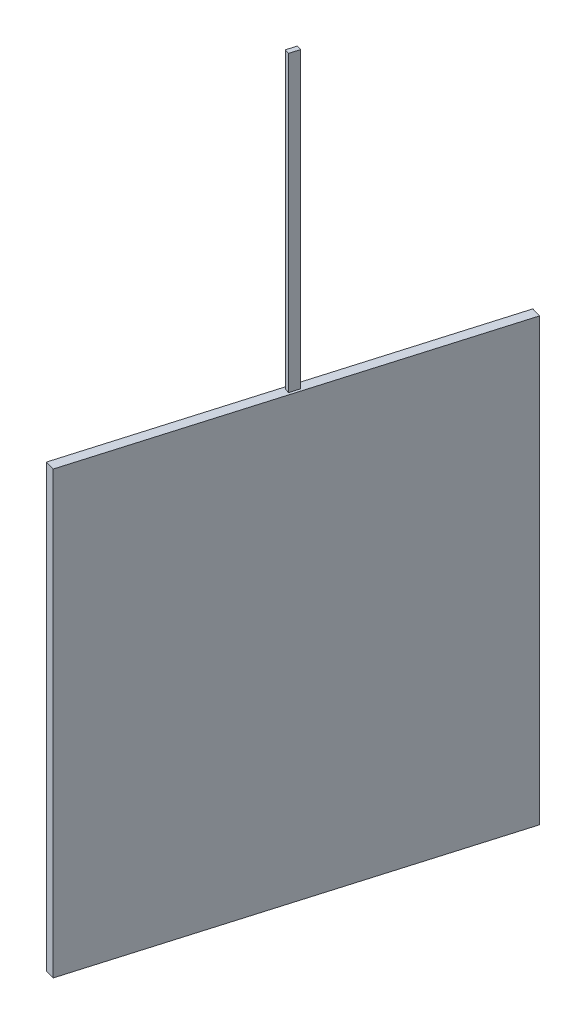
ISO-10303-21;
HEADER;
FILE_DESCRIPTION(('STEP AP214'),'2;1');
FILE_NAME('part.step','',(''),(''),'','','');
FILE_SCHEMA(('AUTOMOTIVE_DESIGN { 1 0 10303 214 1 1 1 1 }'));
ENDSEC;
DATA;
#1=APPLICATION_CONTEXT('core data for automotive mechanical design processes');
#2=APPLICATION_PROTOCOL_DEFINITION('international standard','automotive_design',2000,#1);
#3=PRODUCT_CONTEXT('',#1,'mechanical');
#4=PRODUCT('Part','Part','',(#3));
#5=PRODUCT_RELATED_PRODUCT_CATEGORY('part','',(#4));
#6=PRODUCT_DEFINITION_FORMATION('','',#4);
#7=PRODUCT_DEFINITION_CONTEXT('part definition',#1,'design');
#8=PRODUCT_DEFINITION('design','',#6,#7);
#9=PRODUCT_DEFINITION_SHAPE('','',#8);
#10=(LENGTH_UNIT() NAMED_UNIT(*) SI_UNIT(.MILLI.,.METRE.));
#11=(NAMED_UNIT(*) PLANE_ANGLE_UNIT() SI_UNIT($,.RADIAN.));
#12=(NAMED_UNIT(*) SI_UNIT($,.STERADIAN.) SOLID_ANGLE_UNIT());
#13=UNCERTAINTY_MEASURE_WITH_UNIT(LENGTH_MEASURE(1.E-05),#10,'distance_accuracy_value','');
#14=(GEOMETRIC_REPRESENTATION_CONTEXT(3) GLOBAL_UNCERTAINTY_ASSIGNED_CONTEXT((#13)) GLOBAL_UNIT_ASSIGNED_CONTEXT((#10,
#11,#12)) REPRESENTATION_CONTEXT('',''));
#15=CARTESIAN_POINT('',(0.,0.,0.));
#16=DIRECTION('',(0.,0.,1.));
#17=DIRECTION('',(1.,0.,0.));
#18=AXIS2_PLACEMENT_3D('',#15,#16,#17);
#19=CARTESIAN_POINT('',(0.,0.,0.));
#20=DIRECTION('',(0.,-1.,0.));
#21=DIRECTION('',(0.,0.,-1.));
#22=AXIS2_PLACEMENT_3D('',#19,#20,#21);
#23=PLANE('',#22);
#24=DIRECTION('',(-0.282166323991545,0.,0.959365501571272));
#25=VECTOR('',#24,1.);
#26=CARTESIAN_POINT('',(-29.8864927045364,0.,97.113183728172));
#27=LINE('',#26,#25);
#28=CARTESIAN_POINT('',(-1.21839418699542,0.,-0.358351231469239));
#29=VERTEX_POINT('',#28);
#30=CARTESIAN_POINT('',(-29.8864927045364,0.,97.113183728172));
#31=VERTEX_POINT('',#30);
#32=EDGE_CURVE('E138',#29,#31,#27,.T.);
#33=ORIENTED_EDGE('',*,*,#32,.T.);
#34=DIRECTION('',(0.959365501571272,0.,0.282166323991545));
#35=VECTOR('',#34,1.);
#36=CARTESIAN_POINT('',(-27.4497043305455,0.,97.8298861911105));
#37=LINE('',#36,#35);
#38=CARTESIAN_POINT('',(-27.4497043305455,0.,97.8298861911105));
#39=VERTEX_POINT('',#38);
#40=EDGE_CURVE('E143',#31,#39,#37,.T.);
#41=ORIENTED_EDGE('',*,*,#40,.T.);
#42=DIRECTION('',(0.282166323991544,0.,-0.959365501571272));
#43=VECTOR('',#42,1.);
#44=CARTESIAN_POINT('',(1.21839418699542,0.,0.358351231469232));
#45=LINE('',#44,#43);
#46=CARTESIAN_POINT('',(1.21839418699542,0.,0.358351231469232));
#47=VERTEX_POINT('',#46);
#48=EDGE_CURVE('E169',#39,#47,#45,.T.);
#49=ORIENTED_EDGE('',*,*,#48,.T.);
#50=DIRECTION('',(-0.959365501571272,0.,-0.282166323991546));
#51=VECTOR('',#50,1.);
#52=CARTESIAN_POINT('',(-1.21839418699542,0.,-0.358351231469239));
#53=LINE('',#52,#51);
#54=EDGE_CURVE('E154',#47,#29,#53,.T.);
#55=ORIENTED_EDGE('',*,*,#54,.T.);
#56=EDGE_LOOP('',(#33,#41,#49,#55));
#57=FACE_BOUND('',#56,.T.);
#58=DIRECTION('',(-0.959365501571273,0.,-0.282166323991544));
#59=VECTOR('',#58,1.);
#60=CARTESIAN_POINT('',(-13.3665009338036,0.,47.6965489085597));
#61=LINE('',#60,#59);
#62=CARTESIAN_POINT('',(-13.3665009338036,0.,47.6965489085597));
#63=VERTEX_POINT('',#62);
#64=CARTESIAN_POINT('',(-14.5848951207991,0.,47.3381976770904));
#65=VERTEX_POINT('',#64);
#66=EDGE_CURVE('E136',#63,#65,#61,.T.);
#67=ORIENTED_EDGE('',*,*,#66,.F.);
#68=DIRECTION('',(0.282166323991546,0.,-0.959365501571272));
#69=VECTOR('',#68,1.);
#70=CARTESIAN_POINT('',(-14.0832033967421,0.,50.1333372825507));
#71=LINE('',#70,#69);
#72=CARTESIAN_POINT('',(-14.0832033967421,0.,50.1333372825507));
#73=VERTEX_POINT('',#72);
#74=EDGE_CURVE('E133',#73,#63,#71,.T.);
#75=ORIENTED_EDGE('',*,*,#74,.F.);
#76=DIRECTION('',(0.959365501571272,0.,0.282166323991544));
#77=VECTOR('',#76,1.);
#78=CARTESIAN_POINT('',(-15.3015975837376,0.,49.7749860510815));
#79=LINE('',#78,#77);
#80=CARTESIAN_POINT('',(-15.3015975837376,0.,49.7749860510815));
#81=VERTEX_POINT('',#80);
#82=EDGE_CURVE('E70',#81,#73,#79,.T.);
#83=ORIENTED_EDGE('',*,*,#82,.F.);
#84=DIRECTION('',(-0.282166323991545,0.,0.959365501571272));
#85=VECTOR('',#84,1.);
#86=CARTESIAN_POINT('',(-14.5848951207991,0.,47.3381976770904));
#87=LINE('',#86,#85);
#88=EDGE_CURVE('E65',#65,#81,#87,.T.);
#89=ORIENTED_EDGE('',*,*,#88,.F.);
#90=EDGE_LOOP('',(#67,#75,#83,#89));
#91=FACE_BOUND('',#90,.T.);
#92=ADVANCED_FACE('F47',(#57,#91),#23,.F.);
#93=CARTESIAN_POINT('',(-29.8864927045364,-114.3,97.113183728172));
#94=DIRECTION('',(-0.959365501571272,0.,-0.282166323991545));
#95=DIRECTION('',(-0.282166323991545,0.,0.959365501571272));
#96=AXIS2_PLACEMENT_3D('',#93,#94,#95);
#97=PLANE('',#96);
#98=ORIENTED_EDGE('',*,*,#32,.F.);
#99=DIRECTION('',(0.,1.,0.));
#100=VECTOR('',#99,1.);
#101=CARTESIAN_POINT('',(-1.21839418699542,-114.3,-0.358351231469239));
#102=LINE('',#101,#100);
#103=CARTESIAN_POINT('',(-1.21839418699542,-114.3,-0.358351231469239));
#104=VERTEX_POINT('',#103);
#105=EDGE_CURVE('E11',#104,#29,#102,.T.);
#106=ORIENTED_EDGE('',*,*,#105,.F.);
#107=DIRECTION('',(-0.282166323991545,0.,0.959365501571272));
#108=VECTOR('',#107,1.);
#109=CARTESIAN_POINT('',(-29.8864927045364,-114.3,97.113183728172));
#110=LINE('',#109,#108);
#111=CARTESIAN_POINT('',(-29.8864927045364,-114.3,97.113183728172));
#112=VERTEX_POINT('',#111);
#113=EDGE_CURVE('E149',#104,#112,#110,.T.);
#114=ORIENTED_EDGE('',*,*,#113,.T.);
#115=DIRECTION('',(0.,1.,0.));
#116=VECTOR('',#115,1.);
#117=CARTESIAN_POINT('',(-29.8864927045364,-114.3,97.113183728172));
#118=LINE('',#117,#116);
#119=EDGE_CURVE('E51',#112,#31,#118,.T.);
#120=ORIENTED_EDGE('',*,*,#119,.T.);
#121=EDGE_LOOP('',(#98,#106,#114,#120));
#122=FACE_BOUND('',#121,.T.);
#123=ADVANCED_FACE('F49',(#122),#97,.T.);
#124=CARTESIAN_POINT('',(-1.21839418699542,-114.3,-0.358351231469239));
#125=DIRECTION('',(0.282166323991546,0.,-0.959365501571272));
#126=DIRECTION('',(-0.959365501571272,0.,-0.282166323991546));
#127=AXIS2_PLACEMENT_3D('',#124,#125,#126);
#128=PLANE('',#127);
#129=ORIENTED_EDGE('',*,*,#54,.F.);
#130=DIRECTION('',(0.,1.,0.));
#131=VECTOR('',#130,1.);
#132=CARTESIAN_POINT('',(1.21839418699542,-114.3,0.358351231469232));
#133=LINE('',#132,#131);
#134=CARTESIAN_POINT('',(1.21839418699542,-114.3,0.358351231469232));
#135=VERTEX_POINT('',#134);
#136=EDGE_CURVE('E57',#135,#47,#133,.T.);
#137=ORIENTED_EDGE('',*,*,#136,.F.);
#138=DIRECTION('',(-0.959365501571272,0.,-0.282166323991546));
#139=VECTOR('',#138,1.);
#140=CARTESIAN_POINT('',(-1.21839418699542,-114.3,-0.358351231469239));
#141=LINE('',#140,#139);
#142=EDGE_CURVE('E162',#135,#104,#141,.T.);
#143=ORIENTED_EDGE('',*,*,#142,.T.);
#144=ORIENTED_EDGE('',*,*,#105,.T.);
#145=EDGE_LOOP('',(#129,#137,#143,#144));
#146=FACE_BOUND('',#145,.T.);
#147=ADVANCED_FACE('F191',(#146),#128,.T.);
#148=CARTESIAN_POINT('',(1.21839418699542,-114.3,0.358351231469232));
#149=DIRECTION('',(0.959365501571273,0.,0.282166323991544));
#150=DIRECTION('',(0.282166323991544,0.,-0.959365501571272));
#151=AXIS2_PLACEMENT_3D('',#148,#149,#150);
#152=PLANE('',#151);
#153=ORIENTED_EDGE('',*,*,#48,.F.);
#154=DIRECTION('',(0.,1.,0.));
#155=VECTOR('',#154,1.);
#156=CARTESIAN_POINT('',(-27.4497043305455,-114.3,97.8298861911105));
#157=LINE('',#156,#155);
#158=CARTESIAN_POINT('',(-27.4497043305455,-114.3,97.8298861911105));
#159=VERTEX_POINT('',#158);
#160=EDGE_CURVE('E177',#159,#39,#157,.T.);
#161=ORIENTED_EDGE('',*,*,#160,.F.);
#162=DIRECTION('',(0.282166323991544,0.,-0.959365501571272));
#163=VECTOR('',#162,1.);
#164=CARTESIAN_POINT('',(1.21839418699542,-114.3,0.358351231469232));
#165=LINE('',#164,#163);
#166=EDGE_CURVE('E158',#159,#135,#165,.T.);
#167=ORIENTED_EDGE('',*,*,#166,.T.);
#168=ORIENTED_EDGE('',*,*,#136,.T.);
#169=EDGE_LOOP('',(#153,#161,#167,#168));
#170=FACE_BOUND('',#169,.T.);
#171=ADVANCED_FACE('F197',(#170),#152,.T.);
#172=CARTESIAN_POINT('',(-27.4497043305455,-114.3,97.8298861911105));
#173=DIRECTION('',(-0.282166323991545,0.,0.959365501571272));
#174=DIRECTION('',(0.959365501571272,0.,0.282166323991545));
#175=AXIS2_PLACEMENT_3D('',#172,#173,#174);
#176=PLANE('',#175);
#177=ORIENTED_EDGE('',*,*,#40,.F.);
#178=ORIENTED_EDGE('',*,*,#119,.F.);
#179=DIRECTION('',(0.959365501571272,0.,0.282166323991545));
#180=VECTOR('',#179,1.);
#181=CARTESIAN_POINT('',(-27.4497043305455,-114.3,97.8298861911105));
#182=LINE('',#181,#180);
#183=EDGE_CURVE('E153',#112,#159,#182,.T.);
#184=ORIENTED_EDGE('',*,*,#183,.T.);
#185=ORIENTED_EDGE('',*,*,#160,.T.);
#186=EDGE_LOOP('',(#177,#178,#184,#185));
#187=FACE_BOUND('',#186,.T.);
#188=ADVANCED_FACE('F187',(#187),#176,.T.);
#189=CARTESIAN_POINT('',(0.,-114.3,0.));
#190=DIRECTION('',(0.,-1.,0.));
#191=DIRECTION('',(0.,0.,-1.));
#192=AXIS2_PLACEMENT_3D('',#189,#190,#191);
#193=PLANE('',#192);
#194=ORIENTED_EDGE('',*,*,#113,.F.);
#195=ORIENTED_EDGE('',*,*,#142,.F.);
#196=ORIENTED_EDGE('',*,*,#166,.F.);
#197=ORIENTED_EDGE('',*,*,#183,.F.);
#198=EDGE_LOOP('',(#194,#195,#196,#197));
#199=FACE_BOUND('',#198,.T.);
#200=ADVANCED_FACE('F194',(#199),#193,.T.);
#201=CARTESIAN_POINT('',(-13.3665009338036,76.2,47.6965489085597));
#202=DIRECTION('',(-0.282166323991544,0.,0.959365501571273));
#203=DIRECTION('',(0.959365501571273,0.,0.282166323991544));
#204=AXIS2_PLACEMENT_3D('',#201,#202,#203);
#205=PLANE('',#204);
#206=ORIENTED_EDGE('',*,*,#66,.T.);
#207=DIRECTION('',(0.,-1.,0.));
#208=VECTOR('',#207,1.);
#209=CARTESIAN_POINT('',(-14.5848951207991,76.2,47.3381976770904));
#210=LINE('',#209,#208);
#211=CARTESIAN_POINT('',(-14.5848951207991,76.2,47.3381976770904));
#212=VERTEX_POINT('',#211);
#213=EDGE_CURVE('E115',#212,#65,#210,.T.);
#214=ORIENTED_EDGE('',*,*,#213,.F.);
#215=DIRECTION('',(-0.959365501571273,0.,-0.282166323991544));
#216=VECTOR('',#215,1.);
#217=CARTESIAN_POINT('',(-13.3665009338036,76.2,47.6965489085597));
#218=LINE('',#217,#216);
#219=CARTESIAN_POINT('',(-13.3665009338036,76.2,47.6965489085597));
#220=VERTEX_POINT('',#219);
#221=EDGE_CURVE('E123',#220,#212,#218,.T.);
#222=ORIENTED_EDGE('',*,*,#221,.F.);
#223=DIRECTION('',(0.,-1.,0.));
#224=VECTOR('',#223,1.);
#225=CARTESIAN_POINT('',(-13.3665009338036,76.2,47.6965489085597));
#226=LINE('',#225,#224);
#227=EDGE_CURVE('E290',#220,#63,#226,.T.);
#228=ORIENTED_EDGE('',*,*,#227,.T.);
#229=EDGE_LOOP('',(#206,#214,#222,#228));
#230=FACE_BOUND('',#229,.T.);
#231=ADVANCED_FACE('F135',(#230),#205,.F.);
#232=CARTESIAN_POINT('',(-14.5848951207991,76.2,47.3381976770904));
#233=DIRECTION('',(0.959365501571272,0.,0.282166323991545));
#234=DIRECTION('',(0.282166323991545,0.,-0.959365501571272));
#235=AXIS2_PLACEMENT_3D('',#232,#233,#234);
#236=PLANE('',#235);
#237=ORIENTED_EDGE('',*,*,#88,.T.);
#238=DIRECTION('',(0.,-1.,0.));
#239=VECTOR('',#238,1.);
#240=CARTESIAN_POINT('',(-15.3015975837376,76.2,49.7749860510815));
#241=LINE('',#240,#239);
#242=CARTESIAN_POINT('',(-15.3015975837376,76.2,49.7749860510815));
#243=VERTEX_POINT('',#242);
#244=EDGE_CURVE('E118',#243,#81,#241,.T.);
#245=ORIENTED_EDGE('',*,*,#244,.F.);
#246=DIRECTION('',(-0.282166323991545,0.,0.959365501571272));
#247=VECTOR('',#246,1.);
#248=CARTESIAN_POINT('',(-14.5848951207991,76.2,47.3381976770904));
#249=LINE('',#248,#247);
#250=EDGE_CURVE('E111',#212,#243,#249,.T.);
#251=ORIENTED_EDGE('',*,*,#250,.F.);
#252=ORIENTED_EDGE('',*,*,#213,.T.);
#253=EDGE_LOOP('',(#237,#245,#251,#252));
#254=FACE_BOUND('',#253,.T.);
#255=ADVANCED_FACE('F113',(#254),#236,.F.);
#256=CARTESIAN_POINT('',(-15.3015975837376,76.2,49.7749860510815));
#257=DIRECTION('',(0.282166323991544,0.,-0.959365501571272));
#258=DIRECTION('',(-0.959365501571272,0.,-0.282166323991544));
#259=AXIS2_PLACEMENT_3D('',#256,#257,#258);
#260=PLANE('',#259);
#261=ORIENTED_EDGE('',*,*,#82,.T.);
#262=DIRECTION('',(0.,-1.,0.));
#263=VECTOR('',#262,1.);
#264=CARTESIAN_POINT('',(-14.0832033967421,76.2,50.1333372825507));
#265=LINE('',#264,#263);
#266=CARTESIAN_POINT('',(-14.0832033967421,76.2,50.1333372825507));
#267=VERTEX_POINT('',#266);
#268=EDGE_CURVE('E145',#267,#73,#265,.T.);
#269=ORIENTED_EDGE('',*,*,#268,.F.);
#270=DIRECTION('',(0.959365501571272,0.,0.282166323991544));
#271=VECTOR('',#270,1.);
#272=CARTESIAN_POINT('',(-15.3015975837376,76.2,49.7749860510815));
#273=LINE('',#272,#271);
#274=EDGE_CURVE('E122',#243,#267,#273,.T.);
#275=ORIENTED_EDGE('',*,*,#274,.F.);
#276=ORIENTED_EDGE('',*,*,#244,.T.);
#277=EDGE_LOOP('',(#261,#269,#275,#276));
#278=FACE_BOUND('',#277,.T.);
#279=ADVANCED_FACE('F217',(#278),#260,.F.);
#280=CARTESIAN_POINT('',(-14.0832033967421,76.2,50.1333372825507));
#281=DIRECTION('',(-0.959365501571272,0.,-0.282166323991546));
#282=DIRECTION('',(-0.282166323991546,0.,0.959365501571272));
#283=AXIS2_PLACEMENT_3D('',#280,#281,#282);
#284=PLANE('',#283);
#285=ORIENTED_EDGE('',*,*,#74,.T.);
#286=ORIENTED_EDGE('',*,*,#227,.F.);
#287=DIRECTION('',(0.282166323991546,0.,-0.959365501571272));
#288=VECTOR('',#287,1.);
#289=CARTESIAN_POINT('',(-14.0832033967421,76.2,50.1333372825507));
#290=LINE('',#289,#288);
#291=EDGE_CURVE('E128',#267,#220,#290,.T.);
#292=ORIENTED_EDGE('',*,*,#291,.F.);
#293=ORIENTED_EDGE('',*,*,#268,.T.);
#294=EDGE_LOOP('',(#285,#286,#292,#293));
#295=FACE_BOUND('',#294,.T.);
#296=ADVANCED_FACE('F220',(#295),#284,.F.);
#297=CARTESIAN_POINT('',(0.,76.2,0.));
#298=DIRECTION('',(0.,1.,0.));
#299=DIRECTION('',(0.,0.,1.));
#300=AXIS2_PLACEMENT_3D('',#297,#298,#299);
#301=PLANE('',#300);
#302=ORIENTED_EDGE('',*,*,#221,.T.);
#303=ORIENTED_EDGE('',*,*,#250,.T.);
#304=ORIENTED_EDGE('',*,*,#274,.T.);
#305=ORIENTED_EDGE('',*,*,#291,.T.);
#306=EDGE_LOOP('',(#302,#303,#304,#305));
#307=FACE_BOUND('',#306,.T.);
#308=ADVANCED_FACE('F126',(#307),#301,.T.);
#309=CLOSED_SHELL('',(#92,#123,#147,#171,#188,#200,#231,#255,#279,#296,#308));
#310=MANIFOLD_SOLID_BREP('B2',#309);
#311=ADVANCED_BREP_SHAPE_REPRESENTATION('',(#18,#310),#14);
#312=SHAPE_DEFINITION_REPRESENTATION(#9,#311);
ENDSEC;
END-ISO-10303-21;
